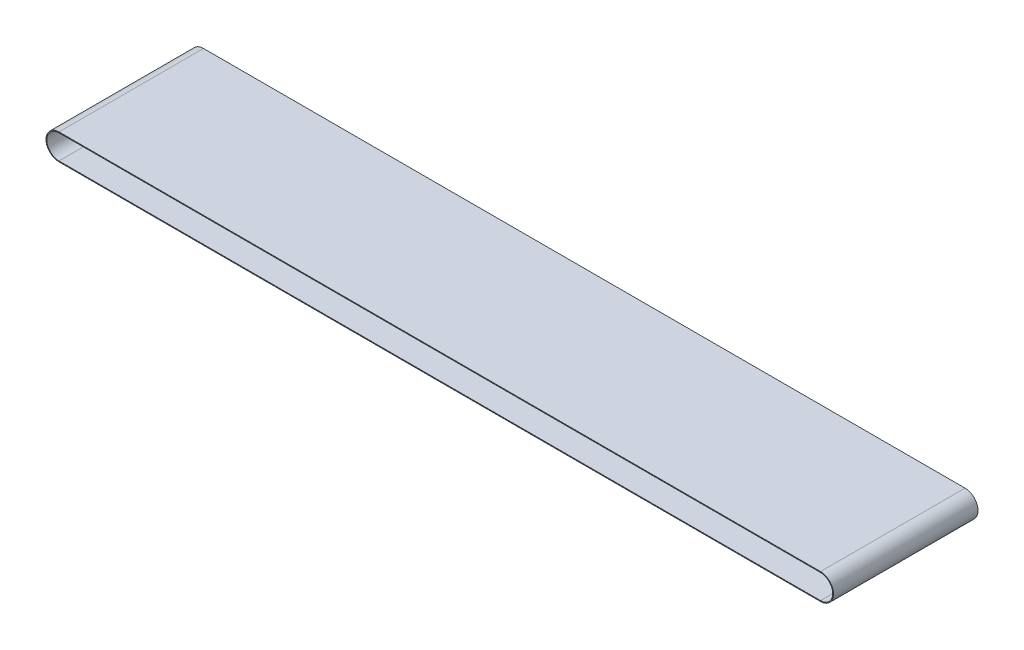
ISO-10303-21;
HEADER;
FILE_DESCRIPTION(('STEP AP214'),'2;1');
FILE_NAME('part.step','',(''),(''),'','','');
FILE_SCHEMA(('AUTOMOTIVE_DESIGN { 1 0 10303 214 1 1 1 1 }'));
ENDSEC;
DATA;
#1=APPLICATION_CONTEXT('core data for automotive mechanical design processes');
#2=APPLICATION_PROTOCOL_DEFINITION('international standard','automotive_design',2000,#1);
#3=PRODUCT_CONTEXT('',#1,'mechanical');
#4=PRODUCT('Part','Part','',(#3));
#5=PRODUCT_RELATED_PRODUCT_CATEGORY('part','',(#4));
#6=PRODUCT_DEFINITION_FORMATION('','',#4);
#7=PRODUCT_DEFINITION_CONTEXT('part definition',#1,'design');
#8=PRODUCT_DEFINITION('design','',#6,#7);
#9=PRODUCT_DEFINITION_SHAPE('','',#8);
#10=(LENGTH_UNIT() NAMED_UNIT(*) SI_UNIT(.MILLI.,.METRE.));
#11=(NAMED_UNIT(*) PLANE_ANGLE_UNIT() SI_UNIT($,.RADIAN.));
#12=(NAMED_UNIT(*) SI_UNIT($,.STERADIAN.) SOLID_ANGLE_UNIT());
#13=UNCERTAINTY_MEASURE_WITH_UNIT(LENGTH_MEASURE(1.E-05),#10,'distance_accuracy_value','');
#14=(GEOMETRIC_REPRESENTATION_CONTEXT(3) GLOBAL_UNCERTAINTY_ASSIGNED_CONTEXT((#13)) GLOBAL_UNIT_ASSIGNED_CONTEXT((#10,
#11,#12)) REPRESENTATION_CONTEXT('',''));
#15=CARTESIAN_POINT('',(0.,0.,0.));
#16=DIRECTION('',(0.,0.,1.));
#17=DIRECTION('',(1.,0.,0.));
#18=AXIS2_PLACEMENT_3D('',#15,#16,#17);
#19=CARTESIAN_POINT('',(242.5,16.,44.5));
#20=DIRECTION('',(0.,0.,-1.));
#21=DIRECTION('',(-1.,0.,0.));
#22=AXIS2_PLACEMENT_3D('',#19,#20,#21);
#23=PLANE('',#22);
#24=DIRECTION('',(1.,0.,0.));
#25=VECTOR('',#24,1.);
#26=CARTESIAN_POINT('',(234.5,0.499999999999987,44.5));
#27=LINE('',#26,#25);
#28=CARTESIAN_POINT('',(-234.5,0.500000000000014,44.5));
#29=VERTEX_POINT('',#28);
#30=CARTESIAN_POINT('',(234.5,0.499999999999987,44.5));
#31=VERTEX_POINT('',#30);
#32=EDGE_CURVE('E124',#29,#31,#27,.T.);
#33=ORIENTED_EDGE('',*,*,#32,.F.);
#34=CARTESIAN_POINT('',(-234.5,8.,44.5));
#35=DIRECTION('',(0.,0.,1.));
#36=DIRECTION('',(1.,0.,0.));
#37=AXIS2_PLACEMENT_3D('',#34,#35,#36);
#38=CIRCLE('',#37,7.49999999999999);
#39=CARTESIAN_POINT('',(-234.5,15.5,44.5));
#40=VERTEX_POINT('',#39);
#41=EDGE_CURVE('E48',#40,#29,#38,.T.);
#42=ORIENTED_EDGE('',*,*,#41,.F.);
#43=DIRECTION('',(-1.,0.,0.));
#44=VECTOR('',#43,1.);
#45=CARTESIAN_POINT('',(-234.5,15.5,44.5));
#46=LINE('',#45,#44);
#47=CARTESIAN_POINT('',(234.5,15.5,44.5));
#48=VERTEX_POINT('',#47);
#49=EDGE_CURVE('E115',#48,#40,#46,.T.);
#50=ORIENTED_EDGE('',*,*,#49,.F.);
#51=CARTESIAN_POINT('',(234.5,8.,44.5));
#52=DIRECTION('',(0.,0.,1.));
#53=DIRECTION('',(1.,0.,0.));
#54=AXIS2_PLACEMENT_3D('',#51,#52,#53);
#55=CIRCLE('',#54,7.50000000000001);
#56=EDGE_CURVE('E118',#31,#48,#55,.T.);
#57=ORIENTED_EDGE('',*,*,#56,.F.);
#58=EDGE_LOOP('',(#33,#42,#50,#57));
#59=FACE_BOUND('',#58,.T.);
#60=DIRECTION('',(1.,0.,0.));
#61=VECTOR('',#60,1.);
#62=CARTESIAN_POINT('',(242.5,0.,44.5));
#63=LINE('',#62,#61);
#64=CARTESIAN_POINT('',(-234.5,0.,44.5));
#65=VERTEX_POINT('',#64);
#66=CARTESIAN_POINT('',(234.5,0.,44.5));
#67=VERTEX_POINT('',#66);
#68=EDGE_CURVE('E154',#65,#67,#63,.T.);
#69=ORIENTED_EDGE('',*,*,#68,.T.);
#70=CARTESIAN_POINT('',(234.5,8.,44.5));
#71=DIRECTION('',(0.,0.,1.));
#72=DIRECTION('',(1.,0.,0.));
#73=AXIS2_PLACEMENT_3D('',#70,#71,#72);
#74=CIRCLE('',#73,8.00000000000001);
#75=CARTESIAN_POINT('',(234.5,16.,44.5));
#76=VERTEX_POINT('',#75);
#77=EDGE_CURVE('E136',#67,#76,#74,.T.);
#78=ORIENTED_EDGE('',*,*,#77,.T.);
#79=DIRECTION('',(1.,0.,0.));
#80=VECTOR('',#79,1.);
#81=CARTESIAN_POINT('',(242.5,16.,44.5));
#82=LINE('',#81,#80);
#83=CARTESIAN_POINT('',(-234.5,16.,44.5));
#84=VERTEX_POINT('',#83);
#85=EDGE_CURVE('E40',#84,#76,#82,.T.);
#86=ORIENTED_EDGE('',*,*,#85,.F.);
#87=CARTESIAN_POINT('',(-234.5,8.,44.5));
#88=DIRECTION('',(0.,0.,1.));
#89=DIRECTION('',(1.,0.,0.));
#90=AXIS2_PLACEMENT_3D('',#87,#88,#89);
#91=CIRCLE('',#90,8.00000000000001);
#92=EDGE_CURVE('E146',#84,#65,#91,.T.);
#93=ORIENTED_EDGE('',*,*,#92,.T.);
#94=EDGE_LOOP('',(#69,#78,#86,#93));
#95=FACE_BOUND('',#94,.T.);
#96=ADVANCED_FACE('F32',(#59,#95),#23,.F.);
#97=CARTESIAN_POINT('',(242.5,16.,-44.5));
#98=DIRECTION('',(0.,0.,1.));
#99=DIRECTION('',(1.,0.,0.));
#100=AXIS2_PLACEMENT_3D('',#97,#98,#99);
#101=PLANE('',#100);
#102=DIRECTION('',(-1.,0.,0.));
#103=VECTOR('',#102,1.);
#104=CARTESIAN_POINT('',(-234.5,15.5,-44.5));
#105=LINE('',#104,#103);
#106=CARTESIAN_POINT('',(234.5,15.5,-44.5));
#107=VERTEX_POINT('',#106);
#108=CARTESIAN_POINT('',(-234.5,15.5,-44.5));
#109=VERTEX_POINT('',#108);
#110=EDGE_CURVE('E105',#107,#109,#105,.T.);
#111=ORIENTED_EDGE('',*,*,#110,.T.);
#112=CARTESIAN_POINT('',(-234.5,8.,-44.5));
#113=DIRECTION('',(0.,0.,1.));
#114=DIRECTION('',(1.,0.,0.));
#115=AXIS2_PLACEMENT_3D('',#112,#113,#114);
#116=CIRCLE('',#115,7.49999999999999);
#117=CARTESIAN_POINT('',(-234.5,0.500000000000014,-44.5));
#118=VERTEX_POINT('',#117);
#119=EDGE_CURVE('E99',#109,#118,#116,.T.);
#120=ORIENTED_EDGE('',*,*,#119,.T.);
#121=DIRECTION('',(1.,0.,0.));
#122=VECTOR('',#121,1.);
#123=CARTESIAN_POINT('',(234.5,0.499999999999987,-44.5));
#124=LINE('',#123,#122);
#125=CARTESIAN_POINT('',(234.5,0.499999999999987,-44.5));
#126=VERTEX_POINT('',#125);
#127=EDGE_CURVE('E108',#118,#126,#124,.T.);
#128=ORIENTED_EDGE('',*,*,#127,.T.);
#129=CARTESIAN_POINT('',(234.5,8.,-44.5));
#130=DIRECTION('',(0.,0.,1.));
#131=DIRECTION('',(1.,0.,0.));
#132=AXIS2_PLACEMENT_3D('',#129,#130,#131);
#133=CIRCLE('',#132,7.50000000000001);
#134=EDGE_CURVE('E56',#126,#107,#133,.T.);
#135=ORIENTED_EDGE('',*,*,#134,.T.);
#136=EDGE_LOOP('',(#111,#120,#128,#135));
#137=FACE_BOUND('',#136,.T.);
#138=CARTESIAN_POINT('',(234.5,8.,-44.5));
#139=DIRECTION('',(0.,0.,1.));
#140=DIRECTION('',(1.,0.,0.));
#141=AXIS2_PLACEMENT_3D('',#138,#139,#140);
#142=CIRCLE('',#141,8.00000000000001);
#143=CARTESIAN_POINT('',(234.5,0.,-44.5));
#144=VERTEX_POINT('',#143);
#145=CARTESIAN_POINT('',(234.5,16.,-44.5));
#146=VERTEX_POINT('',#145);
#147=EDGE_CURVE('E137',#144,#146,#142,.T.);
#148=ORIENTED_EDGE('',*,*,#147,.F.);
#149=DIRECTION('',(-1.,0.,0.));
#150=VECTOR('',#149,1.);
#151=CARTESIAN_POINT('',(242.5,0.,-44.5));
#152=LINE('',#151,#150);
#153=CARTESIAN_POINT('',(-234.5,0.,-44.5));
#154=VERTEX_POINT('',#153);
#155=EDGE_CURVE('E35',#144,#154,#152,.T.);
#156=ORIENTED_EDGE('',*,*,#155,.T.);
#157=CARTESIAN_POINT('',(-234.5,8.,-44.5));
#158=DIRECTION('',(0.,0.,1.));
#159=DIRECTION('',(1.,0.,0.));
#160=AXIS2_PLACEMENT_3D('',#157,#158,#159);
#161=CIRCLE('',#160,8.00000000000001);
#162=CARTESIAN_POINT('',(-234.5,16.,-44.5));
#163=VERTEX_POINT('',#162);
#164=EDGE_CURVE('E147',#163,#154,#161,.T.);
#165=ORIENTED_EDGE('',*,*,#164,.F.);
#166=DIRECTION('',(-1.,0.,0.));
#167=VECTOR('',#166,1.);
#168=CARTESIAN_POINT('',(242.5,16.,-44.5));
#169=LINE('',#168,#167);
#170=EDGE_CURVE('E11',#146,#163,#169,.T.);
#171=ORIENTED_EDGE('',*,*,#170,.F.);
#172=EDGE_LOOP('',(#148,#156,#165,#171));
#173=FACE_BOUND('',#172,.T.);
#174=ADVANCED_FACE('F112',(#137,#173),#101,.F.);
#175=CARTESIAN_POINT('',(0.,16.,0.));
#176=DIRECTION('',(0.,1.,0.));
#177=DIRECTION('',(0.,0.,1.));
#178=AXIS2_PLACEMENT_3D('',#175,#176,#177);
#179=PLANE('',#178);
#180=DIRECTION('',(0.,0.,1.));
#181=VECTOR('',#180,1.);
#182=CARTESIAN_POINT('',(234.5,16.,-44.5));
#183=LINE('',#182,#181);
#184=EDGE_CURVE('E139',#146,#76,#183,.T.);
#185=ORIENTED_EDGE('',*,*,#184,.F.);
#186=ORIENTED_EDGE('',*,*,#170,.T.);
#187=DIRECTION('',(0.,0.,1.));
#188=VECTOR('',#187,1.);
#189=CARTESIAN_POINT('',(-234.5,16.,-44.5));
#190=LINE('',#189,#188);
#191=EDGE_CURVE('E143',#163,#84,#190,.T.);
#192=ORIENTED_EDGE('',*,*,#191,.T.);
#193=ORIENTED_EDGE('',*,*,#85,.T.);
#194=EDGE_LOOP('',(#185,#186,#192,#193));
#195=FACE_BOUND('',#194,.T.);
#196=ADVANCED_FACE('F174',(#195),#179,.T.);
#197=CARTESIAN_POINT('',(0.,0.,0.));
#198=DIRECTION('',(0.,1.,0.));
#199=DIRECTION('',(0.,0.,1.));
#200=AXIS2_PLACEMENT_3D('',#197,#198,#199);
#201=PLANE('',#200);
#202=ORIENTED_EDGE('',*,*,#155,.F.);
#203=DIRECTION('',(0.,0.,1.));
#204=VECTOR('',#203,1.);
#205=CARTESIAN_POINT('',(234.5,0.,-44.5));
#206=LINE('',#205,#204);
#207=EDGE_CURVE('E130',#144,#67,#206,.T.);
#208=ORIENTED_EDGE('',*,*,#207,.T.);
#209=ORIENTED_EDGE('',*,*,#68,.F.);
#210=DIRECTION('',(0.,0.,1.));
#211=VECTOR('',#210,1.);
#212=CARTESIAN_POINT('',(-234.5,0.,-44.5));
#213=LINE('',#212,#211);
#214=EDGE_CURVE('E150',#154,#65,#213,.T.);
#215=ORIENTED_EDGE('',*,*,#214,.F.);
#216=EDGE_LOOP('',(#202,#208,#209,#215));
#217=FACE_BOUND('',#216,.T.);
#218=ADVANCED_FACE('F168',(#217),#201,.F.);
#219=CARTESIAN_POINT('',(-234.5,8.,-44.5));
#220=DIRECTION('',(0.,0.,1.));
#221=DIRECTION('',(1.,0.,0.));
#222=AXIS2_PLACEMENT_3D('',#219,#220,#221);
#223=CYLINDRICAL_SURFACE('',#222,8.00000000000001);
#224=ORIENTED_EDGE('',*,*,#92,.F.);
#225=ORIENTED_EDGE('',*,*,#191,.F.);
#226=ORIENTED_EDGE('',*,*,#164,.T.);
#227=ORIENTED_EDGE('',*,*,#214,.T.);
#228=EDGE_LOOP('',(#224,#225,#226,#227));
#229=FACE_BOUND('',#228,.T.);
#230=ADVANCED_FACE('F167',(#229),#223,.T.);
#231=CARTESIAN_POINT('',(234.5,8.,-44.5));
#232=DIRECTION('',(0.,0.,1.));
#233=DIRECTION('',(1.,0.,0.));
#234=AXIS2_PLACEMENT_3D('',#231,#232,#233);
#235=CYLINDRICAL_SURFACE('',#234,8.00000000000001);
#236=ORIENTED_EDGE('',*,*,#77,.F.);
#237=ORIENTED_EDGE('',*,*,#207,.F.);
#238=ORIENTED_EDGE('',*,*,#147,.T.);
#239=ORIENTED_EDGE('',*,*,#184,.T.);
#240=EDGE_LOOP('',(#236,#237,#238,#239));
#241=FACE_BOUND('',#240,.T.);
#242=ADVANCED_FACE('F170',(#241),#235,.T.);
#243=CARTESIAN_POINT('',(-234.5,8.,-44.5));
#244=DIRECTION('',(0.,0.,1.));
#245=DIRECTION('',(1.,0.,0.));
#246=AXIS2_PLACEMENT_3D('',#243,#244,#245);
#247=CYLINDRICAL_SURFACE('',#246,7.49999999999999);
#248=ORIENTED_EDGE('',*,*,#41,.T.);
#249=DIRECTION('',(0.,0.,1.));
#250=VECTOR('',#249,1.);
#251=CARTESIAN_POINT('',(-234.5,0.500000000000014,-44.5));
#252=LINE('',#251,#250);
#253=EDGE_CURVE('E95',#118,#29,#252,.T.);
#254=ORIENTED_EDGE('',*,*,#253,.F.);
#255=ORIENTED_EDGE('',*,*,#119,.F.);
#256=DIRECTION('',(0.,0.,1.));
#257=VECTOR('',#256,1.);
#258=CARTESIAN_POINT('',(-234.5,15.5,-44.5));
#259=LINE('',#258,#257);
#260=EDGE_CURVE('E128',#109,#40,#259,.T.);
#261=ORIENTED_EDGE('',*,*,#260,.T.);
#262=EDGE_LOOP('',(#248,#254,#255,#261));
#263=FACE_BOUND('',#262,.T.);
#264=ADVANCED_FACE('F97',(#263),#247,.F.);
#265=CARTESIAN_POINT('',(-234.5,15.5,-44.5));
#266=DIRECTION('',(0.,1.,0.));
#267=DIRECTION('',(-1.,0.,0.));
#268=AXIS2_PLACEMENT_3D('',#265,#266,#267);
#269=PLANE('',#268);
#270=ORIENTED_EDGE('',*,*,#49,.T.);
#271=ORIENTED_EDGE('',*,*,#260,.F.);
#272=ORIENTED_EDGE('',*,*,#110,.F.);
#273=DIRECTION('',(0.,0.,1.));
#274=VECTOR('',#273,1.);
#275=CARTESIAN_POINT('',(234.5,15.5,-44.5));
#276=LINE('',#275,#274);
#277=EDGE_CURVE('E131',#107,#48,#276,.T.);
#278=ORIENTED_EDGE('',*,*,#277,.T.);
#279=EDGE_LOOP('',(#270,#271,#272,#278));
#280=FACE_BOUND('',#279,.T.);
#281=ADVANCED_FACE('F191',(#280),#269,.F.);
#282=CARTESIAN_POINT('',(234.5,8.,-44.5));
#283=DIRECTION('',(0.,0.,1.));
#284=DIRECTION('',(1.,0.,0.));
#285=AXIS2_PLACEMENT_3D('',#282,#283,#284);
#286=CYLINDRICAL_SURFACE('',#285,7.50000000000001);
#287=ORIENTED_EDGE('',*,*,#56,.T.);
#288=ORIENTED_EDGE('',*,*,#277,.F.);
#289=ORIENTED_EDGE('',*,*,#134,.F.);
#290=DIRECTION('',(0.,0.,1.));
#291=VECTOR('',#290,1.);
#292=CARTESIAN_POINT('',(234.5,0.499999999999987,-44.5));
#293=LINE('',#292,#291);
#294=EDGE_CURVE('E104',#126,#31,#293,.T.);
#295=ORIENTED_EDGE('',*,*,#294,.T.);
#296=EDGE_LOOP('',(#287,#288,#289,#295));
#297=FACE_BOUND('',#296,.T.);
#298=ADVANCED_FACE('F189',(#297),#286,.F.);
#299=CARTESIAN_POINT('',(234.5,0.499999999999987,-44.5));
#300=DIRECTION('',(0.,-1.,0.));
#301=DIRECTION('',(1.,0.,0.));
#302=AXIS2_PLACEMENT_3D('',#299,#300,#301);
#303=PLANE('',#302);
#304=ORIENTED_EDGE('',*,*,#32,.T.);
#305=ORIENTED_EDGE('',*,*,#294,.F.);
#306=ORIENTED_EDGE('',*,*,#127,.F.);
#307=ORIENTED_EDGE('',*,*,#253,.T.);
#308=EDGE_LOOP('',(#304,#305,#306,#307));
#309=FACE_BOUND('',#308,.T.);
#310=ADVANCED_FACE('F109',(#309),#303,.F.);
#311=CLOSED_SHELL('',(#96,#174,#196,#218,#230,#242,#264,#281,#298,#310));
#312=MANIFOLD_SOLID_BREP('B2',#311);
#313=ADVANCED_BREP_SHAPE_REPRESENTATION('',(#18,#312),#14);
#314=SHAPE_DEFINITION_REPRESENTATION(#9,#313);
ENDSEC;
END-ISO-10303-21;
